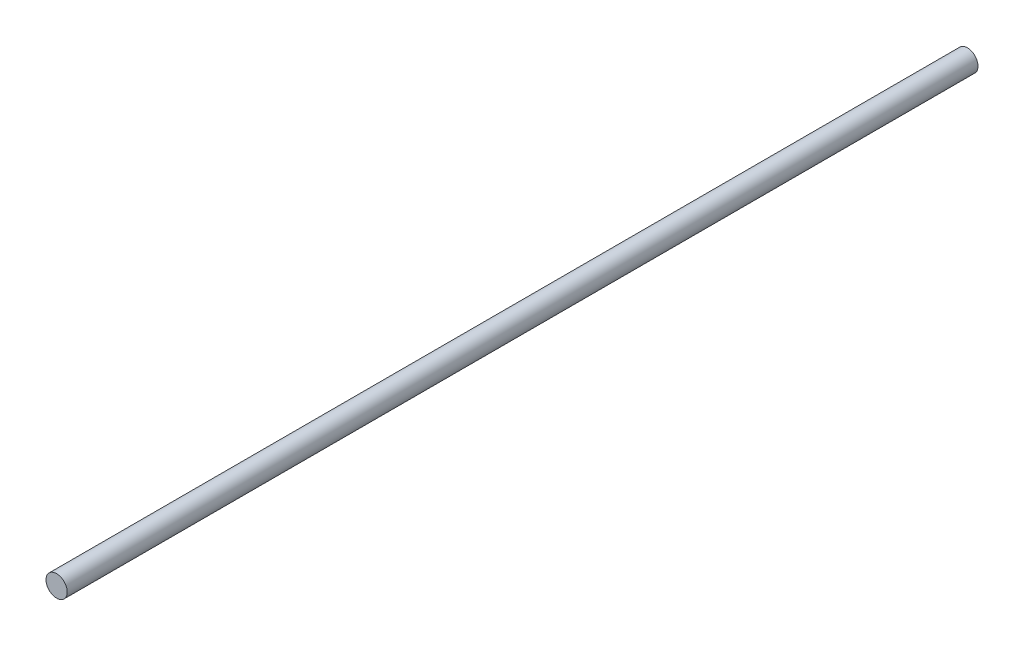
ISO-10303-21;
HEADER;
FILE_DESCRIPTION(('STEP AP214'),'2;1');
FILE_NAME('part.step','',(''),(''),'','','');
FILE_SCHEMA(('AUTOMOTIVE_DESIGN { 1 0 10303 214 1 1 1 1 }'));
ENDSEC;
DATA;
#1=APPLICATION_CONTEXT('core data for automotive mechanical design processes');
#2=APPLICATION_PROTOCOL_DEFINITION('international standard','automotive_design',2000,#1);
#3=PRODUCT_CONTEXT('',#1,'mechanical');
#4=PRODUCT('Part','Part','',(#3));
#5=PRODUCT_RELATED_PRODUCT_CATEGORY('part','',(#4));
#6=PRODUCT_DEFINITION_FORMATION('','',#4);
#7=PRODUCT_DEFINITION_CONTEXT('part definition',#1,'design');
#8=PRODUCT_DEFINITION('design','',#6,#7);
#9=PRODUCT_DEFINITION_SHAPE('','',#8);
#10=(LENGTH_UNIT() NAMED_UNIT(*) SI_UNIT(.MILLI.,.METRE.));
#11=(NAMED_UNIT(*) PLANE_ANGLE_UNIT() SI_UNIT($,.RADIAN.));
#12=(NAMED_UNIT(*) SI_UNIT($,.STERADIAN.) SOLID_ANGLE_UNIT());
#13=UNCERTAINTY_MEASURE_WITH_UNIT(LENGTH_MEASURE(1.E-05),#10,'distance_accuracy_value','');
#14=(GEOMETRIC_REPRESENTATION_CONTEXT(3) GLOBAL_UNCERTAINTY_ASSIGNED_CONTEXT((#13)) GLOBAL_UNIT_ASSIGNED_CONTEXT((#10,
#11,#12)) REPRESENTATION_CONTEXT('',''));
#15=CARTESIAN_POINT('',(0.,0.,0.));
#16=DIRECTION('',(0.,0.,1.));
#17=DIRECTION('',(1.,0.,0.));
#18=AXIS2_PLACEMENT_3D('',#15,#16,#17);
#19=CARTESIAN_POINT('',(0.,0.,-1500.));
#20=DIRECTION('',(0.,0.,1.));
#21=DIRECTION('',(1.,0.,0.));
#22=AXIS2_PLACEMENT_3D('',#19,#20,#21);
#23=CYLINDRICAL_SURFACE('',#22,17.5);
#24=CARTESIAN_POINT('',(0.,0.,-1500.));
#25=DIRECTION('',(0.,0.,1.));
#26=DIRECTION('',(1.,0.,0.));
#27=AXIS2_PLACEMENT_3D('',#24,#25,#26);
#28=CIRCLE('',#27,17.5);
#29=CARTESIAN_POINT('',(17.5,0.,-1500.));
#30=VERTEX_POINT('',#29);
#31=EDGE_CURVE('E10',#30,#30,#28,.T.);
#32=ORIENTED_EDGE('',*,*,#31,.T.);
#33=EDGE_LOOP('',(#32));
#34=FACE_BOUND('',#33,.T.);
#35=CARTESIAN_POINT('',(0.,0.,0.));
#36=DIRECTION('',(0.,0.,1.));
#37=DIRECTION('',(1.,0.,0.));
#38=AXIS2_PLACEMENT_3D('',#35,#36,#37);
#39=CIRCLE('',#38,17.5);
#40=CARTESIAN_POINT('',(17.5,0.,0.));
#41=VERTEX_POINT('',#40);
#42=EDGE_CURVE('E40',#41,#41,#39,.T.);
#43=ORIENTED_EDGE('',*,*,#42,.F.);
#44=EDGE_LOOP('',(#43));
#45=FACE_BOUND('',#44,.T.);
#46=ADVANCED_FACE('F37',(#34,#45),#23,.T.);
#47=CARTESIAN_POINT('',(0.,0.,-1500.));
#48=DIRECTION('',(0.,0.,1.));
#49=DIRECTION('',(1.,0.,0.));
#50=AXIS2_PLACEMENT_3D('',#47,#48,#49);
#51=PLANE('',#50);
#52=ORIENTED_EDGE('',*,*,#31,.F.);
#53=EDGE_LOOP('',(#52));
#54=FACE_BOUND('',#53,.T.);
#55=ADVANCED_FACE('F54',(#54),#51,.F.);
#56=CARTESIAN_POINT('',(0.,0.,0.));
#57=DIRECTION('',(0.,0.,1.));
#58=DIRECTION('',(1.,0.,0.));
#59=AXIS2_PLACEMENT_3D('',#56,#57,#58);
#60=PLANE('',#59);
#61=ORIENTED_EDGE('',*,*,#42,.T.);
#62=EDGE_LOOP('',(#61));
#63=FACE_BOUND('',#62,.T.);
#64=ADVANCED_FACE('F51',(#63),#60,.T.);
#65=CLOSED_SHELL('',(#46,#55,#64));
#66=MANIFOLD_SOLID_BREP('B2',#65);
#67=ADVANCED_BREP_SHAPE_REPRESENTATION('',(#18,#66),#14);
#68=SHAPE_DEFINITION_REPRESENTATION(#9,#67);
ENDSEC;
END-ISO-10303-21;
